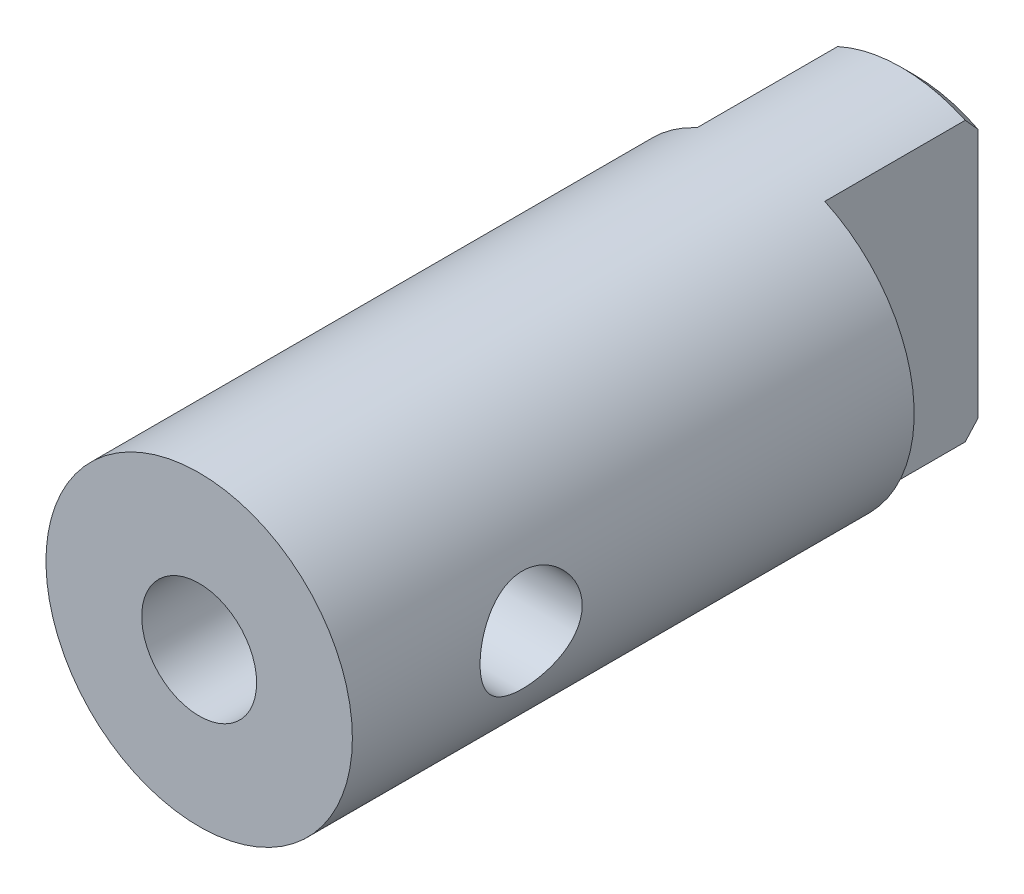
ISO-10303-21;
HEADER;
FILE_DESCRIPTION(('STEP AP214'),'2;1');
FILE_NAME('part.step','',(''),(''),'','','');
FILE_SCHEMA(('AUTOMOTIVE_DESIGN { 1 0 10303 214 1 1 1 1 }'));
ENDSEC;
DATA;
#1=APPLICATION_CONTEXT('core data for automotive mechanical design processes');
#2=APPLICATION_PROTOCOL_DEFINITION('international standard','automotive_design',2000,#1);
#3=PRODUCT_CONTEXT('',#1,'mechanical');
#4=PRODUCT('Part','Part','',(#3));
#5=PRODUCT_RELATED_PRODUCT_CATEGORY('part','',(#4));
#6=PRODUCT_DEFINITION_FORMATION('','',#4);
#7=PRODUCT_DEFINITION_CONTEXT('part definition',#1,'design');
#8=PRODUCT_DEFINITION('design','',#6,#7);
#9=PRODUCT_DEFINITION_SHAPE('','',#8);
#10=(LENGTH_UNIT() NAMED_UNIT(*) SI_UNIT(.MILLI.,.METRE.));
#11=(NAMED_UNIT(*) PLANE_ANGLE_UNIT() SI_UNIT($,.RADIAN.));
#12=(NAMED_UNIT(*) SI_UNIT($,.STERADIAN.) SOLID_ANGLE_UNIT());
#13=UNCERTAINTY_MEASURE_WITH_UNIT(LENGTH_MEASURE(1.E-05),#10,'distance_accuracy_value','');
#14=(GEOMETRIC_REPRESENTATION_CONTEXT(3) GLOBAL_UNCERTAINTY_ASSIGNED_CONTEXT((#13)) GLOBAL_UNIT_ASSIGNED_CONTEXT((#10,
#11,#12)) REPRESENTATION_CONTEXT('',''));
#15=CARTESIAN_POINT('',(0.,0.,0.));
#16=DIRECTION('',(0.,0.,1.));
#17=DIRECTION('',(1.,0.,0.));
#18=AXIS2_PLACEMENT_3D('',#15,#16,#17);
#19=CARTESIAN_POINT('',(0.,0.,28.));
#20=DIRECTION('',(0.,0.,1.));
#21=DIRECTION('',(1.,0.,0.));
#22=AXIS2_PLACEMENT_3D('',#19,#20,#21);
#23=PLANE('',#22);
#24=CARTESIAN_POINT('',(0.,0.,28.));
#25=DIRECTION('',(0.,0.,1.));
#26=DIRECTION('',(1.,0.,0.));
#27=AXIS2_PLACEMENT_3D('',#24,#25,#26);
#28=CIRCLE('',#27,6.);
#29=CARTESIAN_POINT('',(6.,0.,28.));
#30=VERTEX_POINT('',#29);
#31=EDGE_CURVE('E203',#30,#30,#28,.T.);
#32=ORIENTED_EDGE('',*,*,#31,.T.);
#33=EDGE_LOOP('',(#32));
#34=FACE_BOUND('',#33,.T.);
#35=CARTESIAN_POINT('',(0.,0.,28.));
#36=DIRECTION('',(0.,0.,1.));
#37=DIRECTION('',(1.,0.,0.));
#38=AXIS2_PLACEMENT_3D('',#35,#36,#37);
#39=CIRCLE('',#38,2.25);
#40=CARTESIAN_POINT('',(2.25,0.,28.));
#41=VERTEX_POINT('',#40);
#42=EDGE_CURVE('E183',#41,#41,#39,.T.);
#43=ORIENTED_EDGE('',*,*,#42,.F.);
#44=EDGE_LOOP('',(#43));
#45=FACE_BOUND('',#44,.T.);
#46=ADVANCED_FACE('F31',(#34,#45),#23,.T.);
#47=CARTESIAN_POINT('',(0.,0.,28.));
#48=DIRECTION('',(0.,0.,-1.));
#49=DIRECTION('',(-1.,0.,0.));
#50=AXIS2_PLACEMENT_3D('',#47,#48,#49);
#51=CYLINDRICAL_SURFACE('',#50,6.);
#52=CARTESIAN_POINT('',(6.,0.,19.));
#53=CARTESIAN_POINT('',(6.00000030601888,-0.109126725773446,18.9999994925367));
#54=CARTESIAN_POINT('',(5.9969953901509,-0.2182503890771,19.0089605322544));
#55=CARTESIAN_POINT('',(5.98530420406562,-0.433283521745944,19.0444582176344));
#56=CARTESIAN_POINT('',(5.97661734404305,-0.539192656237635,19.0709966878978));
#57=CARTESIAN_POINT('',(5.95450615812885,-0.744665579003552,19.1406384867681));
#58=CARTESIAN_POINT('',(5.94108975461707,-0.844239651772068,19.1837141249185));
#59=CARTESIAN_POINT('',(5.91088891434684,-1.03474987361065,19.2850823456767));
#60=CARTESIAN_POINT('',(5.89410381335556,-1.12568431391741,19.3433779300052));
#61=CARTESIAN_POINT('',(5.8582818888601,-1.29948335004453,19.4756516097175));
#62=CARTESIAN_POINT('',(5.8391911292757,-1.38200740059662,19.550062468521));
#63=CARTESIAN_POINT('',(5.80120629566243,-1.53366538540417,19.7115343094131));
#64=CARTESIAN_POINT('',(5.78231226581098,-1.60279637097892,19.798598069857));
#65=CARTESIAN_POINT('',(5.74626664954548,-1.72764988445572,19.9859702303929));
#66=CARTESIAN_POINT('',(5.72918078551376,-1.78292971644206,20.0865874794642));
#67=CARTESIAN_POINT('',(5.69950610837202,-1.87563774775544,20.2963521889171));
#68=CARTESIAN_POINT('',(5.68691592321491,-1.91307139477353,20.4054970343255));
#69=CARTESIAN_POINT('',(5.66822606538755,-1.96774692301833,20.6253464429934));
#70=CARTESIAN_POINT('',(5.66192191539223,-1.98562689654354,20.7358744169781));
#71=CARTESIAN_POINT('',(5.65591313259015,-2.00268224666895,20.9585275083118));
#72=CARTESIAN_POINT('',(5.6562064604546,-2.00186340320944,21.0706521214184));
#73=CARTESIAN_POINT('',(5.6631803001636,-1.98203980740684,21.287873260888));
#74=CARTESIAN_POINT('',(5.66956831735066,-1.96386782633399,21.393056805838));
#75=CARTESIAN_POINT('',(5.68753315449102,-1.91121232569883,21.5987868392137));
#76=CARTESIAN_POINT('',(5.69911059568215,-1.87672685318374,21.6993327708701));
#77=CARTESIAN_POINT('',(5.72635822262498,-1.79187811612042,21.894825499183));
#78=CARTESIAN_POINT('',(5.74209131586235,-1.74126809741452,21.9896560509391));
#79=CARTESIAN_POINT('',(5.77585117151453,-1.62577821260628,22.1697418165595));
#80=CARTESIAN_POINT('',(5.79387859580927,-1.56089422472801,22.2549942538668));
#81=CARTESIAN_POINT('',(5.83134658335482,-1.41469866536447,22.4181831963215));
#82=CARTESIAN_POINT('',(5.85081178709686,-1.33270630015262,22.4955053890181));
#83=CARTESIAN_POINT('',(5.88813876774073,-1.15667913994013,22.6354625333268));
#84=CARTESIAN_POINT('',(5.90600039076135,-1.06264319132163,22.698096076329));
#85=CARTESIAN_POINT('',(5.93834215875587,-0.863895226092535,22.8073926004701));
#86=CARTESIAN_POINT('',(5.95278700016078,-0.759086552832673,22.8538909826815));
#87=CARTESIAN_POINT('',(5.9764113428887,-0.542538166729016,22.9284063479114));
#88=CARTESIAN_POINT('',(5.98559267309759,-0.430800876309908,22.9564297508469));
#89=CARTESIAN_POINT('',(5.99735254142881,-0.208767659058609,22.9921113320447));
#90=CARTESIAN_POINT('',(6.00020003667456,-0.098619199729693,23.0005996183455));
#91=CARTESIAN_POINT('',(5.99977805389655,0.121550139920474,22.9993346528031));
#92=CARTESIAN_POINT('',(5.99650960838725,0.231571038639301,22.9895844800402));
#93=CARTESIAN_POINT('',(5.98440049434209,0.445039732608511,22.9527761845281));
#94=CARTESIAN_POINT('',(5.97572397422385,0.548585613669687,22.926227587901));
#95=CARTESIAN_POINT('',(5.9538369366014,0.749711917159147,22.8572131110665));
#96=CARTESIAN_POINT('',(5.9406258409335,0.847291577017213,22.8147452010644));
#97=CARTESIAN_POINT('',(5.9105786257458,1.03657659278655,22.7138591363184));
#98=CARTESIAN_POINT('',(5.89365629511572,1.12805991843429,22.6550508134337));
#99=CARTESIAN_POINT('',(5.85810507832525,1.30012966027117,22.523611699973));
#100=CARTESIAN_POINT('',(5.83947567187655,1.38071273559115,22.4509766879365));
#101=CARTESIAN_POINT('',(5.8015369596089,1.5325050156126,22.2900424979868));
#102=CARTESIAN_POINT('',(5.78223522174856,1.60312193849154,22.2011815461463));
#103=CARTESIAN_POINT('',(5.74599946589418,1.72851504464715,22.0124568643782));
#104=CARTESIAN_POINT('',(5.72906546764005,1.78329109586203,21.9125930427318));
#105=CARTESIAN_POINT('',(5.69964783582767,1.87519386083272,21.7046539694202));
#106=CARTESIAN_POINT('',(5.68715521585958,1.91235626433004,21.5965958416625));
#107=CARTESIAN_POINT('',(5.66821664612899,1.96778933351871,21.3752426999117));
#108=CARTESIAN_POINT('',(5.66176797247279,1.98606850990788,21.2619500691913));
#109=CARTESIAN_POINT('',(5.65595717748355,2.00255256495468,21.0396058079182));
#110=CARTESIAN_POINT('',(5.6562480051483,2.0017405146168,20.9306353194264));
#111=CARTESIAN_POINT('',(5.66302539647735,1.98248458689739,20.7144698501559));
#112=CARTESIAN_POINT('',(5.66951159138723,1.96404175891717,20.6072747640898));
#113=CARTESIAN_POINT('',(5.68769048609783,1.91074362625869,20.3997286739951));
#114=CARTESIAN_POINT('',(5.69928196044955,1.87620669203103,20.299286349991));
#115=CARTESIAN_POINT('',(5.72632797636937,1.79195873151949,20.1055451861235));
#116=CARTESIAN_POINT('',(5.74178337526786,1.74224433710761,20.012247937624));
#117=CARTESIAN_POINT('',(5.77565658452092,1.62652138516686,19.8310326601542));
#118=CARTESIAN_POINT('',(5.79417423284274,1.55989648552916,19.7435269962032));
#119=CARTESIAN_POINT('',(5.83166712566506,1.4132857662713,19.5806203732316));
#120=CARTESIAN_POINT('',(5.85064249824745,1.33329616890296,19.5052228486239));
#121=CARTESIAN_POINT('',(5.88780061051088,1.15848311384138,19.3657111754216));
#122=CARTESIAN_POINT('',(5.90592363602513,1.06320302699946,19.302151304498));
#123=CARTESIAN_POINT('',(5.93851982345224,0.86271471481325,19.1920191422987));
#124=CARTESIAN_POINT('',(5.9529939181586,0.757509036264697,19.1454425081559));
#125=CARTESIAN_POINT('',(5.97611030137084,0.544987294401951,19.0725567350227));
#126=CARTESIAN_POINT('',(5.98498424845045,0.437975515352818,19.0454350674732));
#127=CARTESIAN_POINT('',(5.99692814128444,0.220640832020495,19.0091594386457));
#128=CARTESIAN_POINT('',(5.9999996906381,0.110318851137493,19.0000005130069));
#129=CARTESIAN_POINT('',(6.,0.,19.));
#130=B_SPLINE_CURVE_WITH_KNOTS('',3,(#52,#53,#54,#55,#56,#57,#58,#59,#60,#61,#62,#63,#64,#65,
#66,#67,#68,#69,#70,#71,#72,#73,#74,#75,#76,#77,#78,#79,#80,#81,#82,#83,#84,#85,#86,#87,#88,#89,
#90,#91,#92,#93,#94,#95,#96,#97,#98,#99,#100,#101,#102,#103,#104,#105,#106,#107,#108,#109,#110,
#111,#112,#113,#114,#115,#116,#117,#118,#119,#120,#121,#122,#123,#124,#125,#126,#127,#128,#129),
.UNSPECIFIED.,.T.,.F.,(4,2,2,2,2,2,2,2,2,2,2,2,2,2,2,2,2,2,2,2,2,2,2,2,2,2,2,2,2,2,2,2,2,2,2,2,
2,2,4),(0.,0.326974212052022,0.653982370535041,0.980445345740547,1.3069727555982,
1.64369368565512,1.9804886657506,2.32696769646941,2.67334089385667,3.0080385148368,
3.34263267974971,3.6619365310256,3.98127861710964,4.30576342310261,4.63034205116414,
4.97186611622734,5.31342291933236,5.65836811300715,6.00319337754416,6.33307166350339,
6.66289426328353,6.98316315956427,7.30347290568207,7.63220799687473,7.96104361643782,
8.30482045761503,8.64860016469993,8.9916802765354,9.3346056941168,9.65991332128516,
9.9852015870275,10.3043117416083,10.6234927635195,10.9566013338361,11.2898042224756,
11.635993216702,11.9820936230491,12.3127311674763,12.6432773207628),.UNSPECIFIED.);
#131=CARTESIAN_POINT('',(6.,0.,19.));
#132=VERTEX_POINT('',#131);
#133=EDGE_CURVE('E174',#132,#132,#130,.T.);
#134=ORIENTED_EDGE('',*,*,#133,.T.);
#135=EDGE_LOOP('',(#134));
#136=FACE_BOUND('',#135,.T.);
#137=CARTESIAN_POINT('',(-6.,0.,23.));
#138=CARTESIAN_POINT('',(-6.00000030601888,-0.109126725773447,23.0000005074633));
#139=CARTESIAN_POINT('',(-5.9969953901509,-0.218250389077101,22.9910394677456));
#140=CARTESIAN_POINT('',(-5.98530420406562,-0.433283521745945,22.9555417823656));
#141=CARTESIAN_POINT('',(-5.97661734404305,-0.539192656237635,22.9290033121022));
#142=CARTESIAN_POINT('',(-5.95450615812885,-0.744665579003552,22.8593615132319));
#143=CARTESIAN_POINT('',(-5.94108975461707,-0.844239651772068,22.8162858750815));
#144=CARTESIAN_POINT('',(-5.91088891434684,-1.03474987361065,22.7149176543233));
#145=CARTESIAN_POINT('',(-5.89410381335556,-1.12568431391741,22.6566220699948));
#146=CARTESIAN_POINT('',(-5.8582818888601,-1.29948335004453,22.5243483902825));
#147=CARTESIAN_POINT('',(-5.8391911292757,-1.38200740059662,22.449937531479));
#148=CARTESIAN_POINT('',(-5.80120629566243,-1.53366538540417,22.2884656905869));
#149=CARTESIAN_POINT('',(-5.78231226581098,-1.60279637097892,22.201401930143));
#150=CARTESIAN_POINT('',(-5.74626664954548,-1.72764988445572,22.0140297696071));
#151=CARTESIAN_POINT('',(-5.72918078551377,-1.78292971644206,21.9134125205358));
#152=CARTESIAN_POINT('',(-5.69950610837202,-1.87563774775544,21.7036478110829));
#153=CARTESIAN_POINT('',(-5.68691592321491,-1.91307139477353,21.5945029656745));
#154=CARTESIAN_POINT('',(-5.66822606538755,-1.96774692301833,21.3746535570066));
#155=CARTESIAN_POINT('',(-5.66192191539223,-1.98562689654354,21.2641255830219));
#156=CARTESIAN_POINT('',(-5.65591313259015,-2.00268224666895,21.0414724916882));
#157=CARTESIAN_POINT('',(-5.6562064604546,-2.00186340320944,20.9293478785816));
#158=CARTESIAN_POINT('',(-5.6631803001636,-1.98203980740684,20.712126739112));
#159=CARTESIAN_POINT('',(-5.66956831735066,-1.96386782633399,20.606943194162));
#160=CARTESIAN_POINT('',(-5.68753315449102,-1.91121232569883,20.4012131607863));
#161=CARTESIAN_POINT('',(-5.69911059568215,-1.87672685318374,20.3006672291299));
#162=CARTESIAN_POINT('',(-5.72635822262498,-1.79187811612042,20.105174500817));
#163=CARTESIAN_POINT('',(-5.74209131586235,-1.74126809741452,20.0103439490609));
#164=CARTESIAN_POINT('',(-5.77585117151453,-1.62577821260628,19.8302581834406));
#165=CARTESIAN_POINT('',(-5.79387859580927,-1.56089422472801,19.7450057461332));
#166=CARTESIAN_POINT('',(-5.83134658335482,-1.41469866536447,19.5818168036785));
#167=CARTESIAN_POINT('',(-5.85081178709686,-1.33270630015262,19.5044946109819));
#168=CARTESIAN_POINT('',(-5.88813876774073,-1.15667913994013,19.3645374666732));
#169=CARTESIAN_POINT('',(-5.90600039076135,-1.06264319132163,19.301903923671));
#170=CARTESIAN_POINT('',(-5.93834215875587,-0.863895226092536,19.1926073995299));
#171=CARTESIAN_POINT('',(-5.95278700016078,-0.759086552832674,19.1461090173185));
#172=CARTESIAN_POINT('',(-5.9764113428887,-0.542538166729017,19.0715936520886));
#173=CARTESIAN_POINT('',(-5.98559267309759,-0.430800876309908,19.0435702491531));
#174=CARTESIAN_POINT('',(-5.99735254142881,-0.208767659058609,19.0078886679553));
#175=CARTESIAN_POINT('',(-6.00020003667456,-0.0986191997296935,18.9994003816545));
#176=CARTESIAN_POINT('',(-5.99977805389655,0.121550139920474,19.0006653471969));
#177=CARTESIAN_POINT('',(-5.99650960838725,0.2315710386393,19.0104155199598));
#178=CARTESIAN_POINT('',(-5.98440049434209,0.44503973260851,19.0472238154719));
#179=CARTESIAN_POINT('',(-5.97572397422385,0.548585613669686,19.073772412099));
#180=CARTESIAN_POINT('',(-5.9538369366014,0.749711917159147,19.1427868889335));
#181=CARTESIAN_POINT('',(-5.9406258409335,0.847291577017212,19.1852547989356));
#182=CARTESIAN_POINT('',(-5.9105786257458,1.03657659278654,19.2861408636816));
#183=CARTESIAN_POINT('',(-5.89365629511572,1.12805991843429,19.3449491865663));
#184=CARTESIAN_POINT('',(-5.85810507832525,1.30012966027117,19.476388300027));
#185=CARTESIAN_POINT('',(-5.83947567187655,1.38071273559115,19.5490233120635));
#186=CARTESIAN_POINT('',(-5.8015369596089,1.5325050156126,19.7099575020132));
#187=CARTESIAN_POINT('',(-5.78223522174856,1.60312193849154,19.7988184538537));
#188=CARTESIAN_POINT('',(-5.74599946589417,1.72851504464715,19.9875431356218));
#189=CARTESIAN_POINT('',(-5.72906546764005,1.78329109586202,20.0874069572682));
#190=CARTESIAN_POINT('',(-5.69964783582767,1.87519386083272,20.2953460305798));
#191=CARTESIAN_POINT('',(-5.68715521585958,1.91235626433004,20.4034041583375));
#192=CARTESIAN_POINT('',(-5.66821664612899,1.96778933351871,20.6247573000883));
#193=CARTESIAN_POINT('',(-5.66176797247279,1.98606850990788,20.7380499308087));
#194=CARTESIAN_POINT('',(-5.65595717748355,2.00255256495468,20.9603941920818));
#195=CARTESIAN_POINT('',(-5.6562480051483,2.0017405146168,21.0693646805736));
#196=CARTESIAN_POINT('',(-5.66302539647735,1.98248458689739,21.2855301498441));
#197=CARTESIAN_POINT('',(-5.66951159138723,1.96404175891717,21.3927252359102));
#198=CARTESIAN_POINT('',(-5.68769048609783,1.91074362625869,21.6002713260049));
#199=CARTESIAN_POINT('',(-5.69928196044955,1.87620669203103,21.700713650009));
#200=CARTESIAN_POINT('',(-5.72632797636937,1.79195873151949,21.8944548138765));
#201=CARTESIAN_POINT('',(-5.74178337526786,1.74224433710761,21.987752062376));
#202=CARTESIAN_POINT('',(-5.77565658452093,1.62652138516686,22.1689673398458));
#203=CARTESIAN_POINT('',(-5.79417423284274,1.55989648552916,22.2564730037968));
#204=CARTESIAN_POINT('',(-5.83166712566506,1.4132857662713,22.4193796267684));
#205=CARTESIAN_POINT('',(-5.85064249824745,1.33329616890297,22.4947771513761));
#206=CARTESIAN_POINT('',(-5.88780061051088,1.15848311384138,22.6342888245784));
#207=CARTESIAN_POINT('',(-5.90592363602513,1.06320302699946,22.697848695502));
#208=CARTESIAN_POINT('',(-5.93851982345224,0.862714714813249,22.8079808577013));
#209=CARTESIAN_POINT('',(-5.9529939181586,0.757509036264697,22.8545574918441));
#210=CARTESIAN_POINT('',(-5.97611030137084,0.544987294401951,22.9274432649773));
#211=CARTESIAN_POINT('',(-5.98498424845045,0.437975515352817,22.9545649325268));
#212=CARTESIAN_POINT('',(-5.99692814128444,0.220640832020494,22.9908405613543));
#213=CARTESIAN_POINT('',(-5.9999996906381,0.110318851137493,22.9999994869931));
#214=CARTESIAN_POINT('',(-6.,0.,23.));
#215=B_SPLINE_CURVE_WITH_KNOTS('',3,(#137,#138,#139,#140,#141,#142,#143,#144,#145,#146,#147,
#148,#149,#150,#151,#152,#153,#154,#155,#156,#157,#158,#159,#160,#161,#162,#163,#164,#165,#166,
#167,#168,#169,#170,#171,#172,#173,#174,#175,#176,#177,#178,#179,#180,#181,#182,#183,#184,#185,
#186,#187,#188,#189,#190,#191,#192,#193,#194,#195,#196,#197,#198,#199,#200,#201,#202,#203,#204,
#205,#206,#207,#208,#209,#210,#211,#212,#213,#214),.UNSPECIFIED.,.T.,.F.,(4,2,2,2,2,2,2,2,2,2,2,
2,2,2,2,2,2,2,2,2,2,2,2,2,2,2,2,2,2,2,2,2,2,2,2,2,2,2,4),(0.,0.326974212052022,
0.653982370535041,0.980445345740548,1.3069727555982,1.64369368565512,1.9804886657506,
2.32696769646941,2.67334089385667,3.0080385148368,3.34263267974971,3.6619365310256,
3.98127861710964,4.30576342310261,4.63034205116414,4.97186611622734,5.31342291933236,
5.65836811300715,6.00319337754416,6.33307166350339,6.66289426328353,6.98316315956427,
7.30347290568207,7.63220799687473,7.96104361643782,8.30482045761503,8.64860016469993,
8.99168027653541,9.3346056941168,9.65991332128516,9.9852015870275,10.3043117416083,
10.6234927635195,10.9566013338361,11.2898042224756,11.635993216702,11.9820936230491,
12.3127311674763,12.6432773207628),.UNSPECIFIED.);
#216=CARTESIAN_POINT('',(-6.,0.,23.));
#217=VERTEX_POINT('',#216);
#218=EDGE_CURVE('E178',#217,#217,#215,.T.);
#219=ORIENTED_EDGE('',*,*,#218,.T.);
#220=EDGE_LOOP('',(#219));
#221=FACE_BOUND('',#220,.T.);
#222=ORIENTED_EDGE('',*,*,#31,.F.);
#223=EDGE_LOOP('',(#222));
#224=FACE_BOUND('',#223,.T.);
#225=DIRECTION('',(0.,0.,-1.));
#226=VECTOR('',#225,1.);
#227=CARTESIAN_POINT('',(-2.5,-5.45435605731786,28.));
#228=LINE('',#227,#226);
#229=CARTESIAN_POINT('',(-2.5,-5.45435605731786,0.500000000000007));
#230=VERTEX_POINT('',#229);
#231=CARTESIAN_POINT('',(-2.5,-5.45435605731786,6.));
#232=VERTEX_POINT('',#231);
#233=EDGE_CURVE('E191',#230,#232,#228,.F.);
#234=ORIENTED_EDGE('',*,*,#233,.F.);
#235=CARTESIAN_POINT('',(0.,0.,0.500000000000007));
#236=DIRECTION('',(0.,0.,1.));
#237=DIRECTION('',(1.,0.,0.));
#238=AXIS2_PLACEMENT_3D('',#235,#236,#237);
#239=CIRCLE('',#238,6.);
#240=CARTESIAN_POINT('',(2.5,-5.45435605731786,0.500000000000007));
#241=VERTEX_POINT('',#240);
#242=EDGE_CURVE('E217',#230,#241,#239,.T.);
#243=ORIENTED_EDGE('',*,*,#242,.T.);
#244=DIRECTION('',(0.,0.,-1.));
#245=VECTOR('',#244,1.);
#246=CARTESIAN_POINT('',(2.5,-5.45435605731786,28.));
#247=LINE('',#246,#245);
#248=CARTESIAN_POINT('',(2.5,-5.45435605731786,6.));
#249=VERTEX_POINT('',#248);
#250=EDGE_CURVE('E198',#241,#249,#247,.F.);
#251=ORIENTED_EDGE('',*,*,#250,.T.);
#252=CARTESIAN_POINT('',(0.,0.,6.));
#253=DIRECTION('',(0.,0.,-1.));
#254=DIRECTION('',(-1.,0.,0.));
#255=AXIS2_PLACEMENT_3D('',#252,#253,#254);
#256=CIRCLE('',#255,6.);
#257=CARTESIAN_POINT('',(2.5,5.45435605731786,6.));
#258=VERTEX_POINT('',#257);
#259=EDGE_CURVE('E207',#258,#249,#256,.T.);
#260=ORIENTED_EDGE('',*,*,#259,.F.);
#261=DIRECTION('',(0.,0.,-1.));
#262=VECTOR('',#261,1.);
#263=CARTESIAN_POINT('',(2.5,5.45435605731786,28.));
#264=LINE('',#263,#262);
#265=CARTESIAN_POINT('',(2.5,5.45435605731786,0.500000000000007));
#266=VERTEX_POINT('',#265);
#267=EDGE_CURVE('E200',#258,#266,#264,.T.);
#268=ORIENTED_EDGE('',*,*,#267,.T.);
#269=CARTESIAN_POINT('',(0.,0.,0.500000000000007));
#270=DIRECTION('',(0.,0.,1.));
#271=DIRECTION('',(1.,0.,0.));
#272=AXIS2_PLACEMENT_3D('',#269,#270,#271);
#273=CIRCLE('',#272,6.);
#274=CARTESIAN_POINT('',(-2.5,5.45435605731786,0.500000000000007));
#275=VERTEX_POINT('',#274);
#276=EDGE_CURVE('E215',#266,#275,#273,.T.);
#277=ORIENTED_EDGE('',*,*,#276,.T.);
#278=DIRECTION('',(0.,0.,-1.));
#279=VECTOR('',#278,1.);
#280=CARTESIAN_POINT('',(-2.5,5.45435605731786,28.));
#281=LINE('',#280,#279);
#282=CARTESIAN_POINT('',(-2.5,5.45435605731786,6.));
#283=VERTEX_POINT('',#282);
#284=EDGE_CURVE('E193',#283,#275,#281,.T.);
#285=ORIENTED_EDGE('',*,*,#284,.F.);
#286=CARTESIAN_POINT('',(0.,0.,6.));
#287=DIRECTION('',(0.,0.,1.));
#288=DIRECTION('',(1.,0.,0.));
#289=AXIS2_PLACEMENT_3D('',#286,#287,#288);
#290=CIRCLE('',#289,6.);
#291=EDGE_CURVE('E212',#283,#232,#290,.T.);
#292=ORIENTED_EDGE('',*,*,#291,.T.);
#293=EDGE_LOOP('',(#234,#243,#251,#260,#268,#277,#285,#292));
#294=FACE_BOUND('',#293,.T.);
#295=ADVANCED_FACE('F33',(#136,#221,#224,#294),#51,.T.);
#296=CARTESIAN_POINT('',(0.,0.,0.));
#297=DIRECTION('',(0.,0.,1.));
#298=DIRECTION('',(1.,0.,0.));
#299=AXIS2_PLACEMENT_3D('',#296,#297,#298);
#300=PLANE('',#299);
#301=DIRECTION('',(0.,-1.,0.));
#302=VECTOR('',#301,1.);
#303=CARTESIAN_POINT('',(2.5,0.,0.));
#304=LINE('',#303,#302);
#305=CARTESIAN_POINT('',(2.5,4.89897948556635,0.));
#306=VERTEX_POINT('',#305);
#307=CARTESIAN_POINT('',(2.5,-4.89897948556635,0.));
#308=VERTEX_POINT('',#307);
#309=EDGE_CURVE('E205',#306,#308,#304,.T.);
#310=ORIENTED_EDGE('',*,*,#309,.T.);
#311=CARTESIAN_POINT('',(0.,0.,0.));
#312=DIRECTION('',(0.,0.,1.));
#313=DIRECTION('',(1.,0.,0.));
#314=AXIS2_PLACEMENT_3D('',#311,#312,#313);
#315=CIRCLE('',#314,5.5);
#316=CARTESIAN_POINT('',(-2.5,-4.89897948556635,0.));
#317=VERTEX_POINT('',#316);
#318=EDGE_CURVE('E53',#308,#317,#315,.F.);
#319=ORIENTED_EDGE('',*,*,#318,.T.);
#320=DIRECTION('',(0.,-1.,0.));
#321=VECTOR('',#320,1.);
#322=CARTESIAN_POINT('',(-2.5,0.,0.));
#323=LINE('',#322,#321);
#324=CARTESIAN_POINT('',(-2.5,4.89897948556635,0.));
#325=VERTEX_POINT('',#324);
#326=EDGE_CURVE('E210',#325,#317,#323,.T.);
#327=ORIENTED_EDGE('',*,*,#326,.F.);
#328=CARTESIAN_POINT('',(0.,0.,0.));
#329=DIRECTION('',(0.,0.,1.));
#330=DIRECTION('',(1.,0.,0.));
#331=AXIS2_PLACEMENT_3D('',#328,#329,#330);
#332=CIRCLE('',#331,5.5);
#333=EDGE_CURVE('E144',#325,#306,#332,.F.);
#334=ORIENTED_EDGE('',*,*,#333,.T.);
#335=EDGE_LOOP('',(#310,#319,#327,#334));
#336=FACE_BOUND('',#335,.T.);
#337=ADVANCED_FACE('F112',(#336),#300,.F.);
#338=CARTESIAN_POINT('',(8.5,-10.,6.));
#339=DIRECTION('',(0.,0.,-1.));
#340=DIRECTION('',(-1.,0.,0.));
#341=AXIS2_PLACEMENT_3D('',#338,#339,#340);
#342=PLANE('',#341);
#343=ORIENTED_EDGE('',*,*,#259,.T.);
#344=DIRECTION('',(0.,1.,0.));
#345=VECTOR('',#344,1.);
#346=CARTESIAN_POINT('',(2.5,-10.,6.));
#347=LINE('',#346,#345);
#348=EDGE_CURVE('E195',#249,#258,#347,.T.);
#349=ORIENTED_EDGE('',*,*,#348,.T.);
#350=EDGE_LOOP('',(#343,#349));
#351=FACE_BOUND('',#350,.T.);
#352=ADVANCED_FACE('F119',(#351),#342,.T.);
#353=CARTESIAN_POINT('',(2.5,-10.,-1.));
#354=DIRECTION('',(-1.,0.,0.));
#355=DIRECTION('',(0.,0.,1.));
#356=AXIS2_PLACEMENT_3D('',#353,#354,#355);
#357=PLANE('',#356);
#358=ORIENTED_EDGE('',*,*,#250,.F.);
#359=CARTESIAN_POINT('',(2.5,-5.45435605731786,0.500000000000007));
#360=CARTESIAN_POINT('',(2.5,-5.36221449906135,0.416198865027463));
#361=CARTESIAN_POINT('',(2.5,-5.26986235186539,0.332631642381078));
#362=CARTESIAN_POINT('',(2.5,-5.08473682818215,0.165964975454563));
#363=CARTESIAN_POINT('',(2.5,-4.99196345146095,0.0828655314342798));
#364=CARTESIAN_POINT('',(2.5,-4.89897948556635,0.));
#365=B_SPLINE_CURVE_WITH_KNOTS('',3,(#359,#360,#361,#362,#363,#364),.UNSPECIFIED.,.F.,.F.,(4,2,
4),(0.,0.373646354368434,0.747292916272343),.UNSPECIFIED.);
#366=EDGE_CURVE('E138',#241,#308,#365,.T.);
#367=ORIENTED_EDGE('',*,*,#366,.T.);
#368=ORIENTED_EDGE('',*,*,#309,.F.);
#369=CARTESIAN_POINT('',(2.5,4.89897948556635,0.));
#370=CARTESIAN_POINT('',(2.5,4.99196345146095,0.0828655314342794));
#371=CARTESIAN_POINT('',(2.5,5.08473682818215,0.165964975454563));
#372=CARTESIAN_POINT('',(2.5,5.26986235186539,0.332631642381078));
#373=CARTESIAN_POINT('',(2.5,5.36221449906135,0.416198865027463));
#374=CARTESIAN_POINT('',(2.5,5.45435605731786,0.500000000000008));
#375=B_SPLINE_CURVE_WITH_KNOTS('',3,(#369,#370,#371,#372,#373,#374),.UNSPECIFIED.,.F.,.F.,(4,2,
4),(0.,0.373646561903909,0.747292916272344),.UNSPECIFIED.);
#376=EDGE_CURVE('E132',#306,#266,#375,.T.);
#377=ORIENTED_EDGE('',*,*,#376,.T.);
#378=ORIENTED_EDGE('',*,*,#267,.F.);
#379=ORIENTED_EDGE('',*,*,#348,.F.);
#380=EDGE_LOOP('',(#358,#367,#368,#377,#378,#379));
#381=FACE_BOUND('',#380,.T.);
#382=ADVANCED_FACE('F122',(#381),#357,.F.);
#383=CARTESIAN_POINT('',(-8.5,-10.,6.));
#384=DIRECTION('',(0.,0.,1.));
#385=DIRECTION('',(1.,0.,0.));
#386=AXIS2_PLACEMENT_3D('',#383,#384,#385);
#387=PLANE('',#386);
#388=DIRECTION('',(0.,1.,0.));
#389=VECTOR('',#388,1.);
#390=CARTESIAN_POINT('',(-2.5,-10.,6.));
#391=LINE('',#390,#389);
#392=EDGE_CURVE('E188',#232,#283,#391,.T.);
#393=ORIENTED_EDGE('',*,*,#392,.F.);
#394=ORIENTED_EDGE('',*,*,#291,.F.);
#395=EDGE_LOOP('',(#393,#394));
#396=FACE_BOUND('',#395,.T.);
#397=ADVANCED_FACE('F127',(#396),#387,.F.);
#398=CARTESIAN_POINT('',(-2.5,-10.,-3.));
#399=DIRECTION('',(-1.,0.,0.));
#400=DIRECTION('',(0.,0.,1.));
#401=AXIS2_PLACEMENT_3D('',#398,#399,#400);
#402=PLANE('',#401);
#403=ORIENTED_EDGE('',*,*,#326,.T.);
#404=CARTESIAN_POINT('',(-2.5,-4.89897948556635,0.));
#405=CARTESIAN_POINT('',(-2.5,-4.99196345146095,0.0828655314342793));
#406=CARTESIAN_POINT('',(-2.5,-5.08473682818215,0.165964975454563));
#407=CARTESIAN_POINT('',(-2.5,-5.26986235186538,0.332631642381077));
#408=CARTESIAN_POINT('',(-2.5,-5.36221449906135,0.416198865027462));
#409=CARTESIAN_POINT('',(-2.5,-5.45435605731786,0.500000000000007));
#410=B_SPLINE_CURVE_WITH_KNOTS('',3,(#404,#405,#406,#407,#408,#409),.UNSPECIFIED.,.F.,.F.,(4,2,
4),(0.,0.373646561903908,0.747292916272343),.UNSPECIFIED.);
#411=EDGE_CURVE('E11',#317,#230,#410,.T.);
#412=ORIENTED_EDGE('',*,*,#411,.T.);
#413=ORIENTED_EDGE('',*,*,#233,.T.);
#414=ORIENTED_EDGE('',*,*,#392,.T.);
#415=ORIENTED_EDGE('',*,*,#284,.T.);
#416=CARTESIAN_POINT('',(-2.5,5.45435605731786,0.500000000000007));
#417=CARTESIAN_POINT('',(-2.5,5.36221449906135,0.416198865027463));
#418=CARTESIAN_POINT('',(-2.5,5.26986235186538,0.332631642381077));
#419=CARTESIAN_POINT('',(-2.5,5.08473682818215,0.165964975454563));
#420=CARTESIAN_POINT('',(-2.5,4.99196345146095,0.0828655314342792));
#421=CARTESIAN_POINT('',(-2.5,4.89897948556635,0.));
#422=B_SPLINE_CURVE_WITH_KNOTS('',3,(#416,#417,#418,#419,#420,#421),.UNSPECIFIED.,.F.,.F.,(4,2,
4),(0.,0.373646354368434,0.747292916272342),.UNSPECIFIED.);
#423=EDGE_CURVE('E45',#275,#325,#422,.T.);
#424=ORIENTED_EDGE('',*,*,#423,.T.);
#425=EDGE_LOOP('',(#403,#412,#413,#414,#415,#424));
#426=FACE_BOUND('',#425,.T.);
#427=ADVANCED_FACE('F148',(#426),#402,.T.);
#428=CARTESIAN_POINT('',(0.,0.,0.500000000000007));
#429=DIRECTION('',(0.,0.,1.));
#430=DIRECTION('',(1.,0.,0.));
#431=AXIS2_PLACEMENT_3D('',#428,#429,#430);
#432=CONICAL_SURFACE('',#431,6.,0.785398163397445);
#433=ORIENTED_EDGE('',*,*,#411,.F.);
#434=ORIENTED_EDGE('',*,*,#318,.F.);
#435=ORIENTED_EDGE('',*,*,#366,.F.);
#436=ORIENTED_EDGE('',*,*,#242,.F.);
#437=EDGE_LOOP('',(#433,#434,#435,#436));
#438=FACE_BOUND('',#437,.T.);
#439=ADVANCED_FACE('F103',(#438),#432,.T.);
#440=CARTESIAN_POINT('',(0.,0.,0.500000000000007));
#441=DIRECTION('',(0.,0.,1.));
#442=DIRECTION('',(1.,0.,0.));
#443=AXIS2_PLACEMENT_3D('',#440,#441,#442);
#444=CONICAL_SURFACE('',#443,6.,0.785398163397445);
#445=ORIENTED_EDGE('',*,*,#376,.F.);
#446=ORIENTED_EDGE('',*,*,#333,.F.);
#447=ORIENTED_EDGE('',*,*,#423,.F.);
#448=ORIENTED_EDGE('',*,*,#276,.F.);
#449=EDGE_LOOP('',(#445,#446,#447,#448));
#450=FACE_BOUND('',#449,.T.);
#451=ADVANCED_FACE('F94',(#450),#444,.T.);
#452=CARTESIAN_POINT('',(0.,0.,8.14806360718799));
#453=DIRECTION('',(0.,0.,1.));
#454=DIRECTION('',(1.,0.,0.));
#455=AXIS2_PLACEMENT_3D('',#452,#453,#454);
#456=CONICAL_SURFACE('',#455,0.,1.02974425867666);
#457=CARTESIAN_POINT('',(0.,0.,9.5));
#458=DIRECTION('',(0.,0.,1.));
#459=DIRECTION('',(1.,0.,0.));
#460=AXIS2_PLACEMENT_3D('',#457,#458,#459);
#461=CIRCLE('',#460,2.25);
#462=CARTESIAN_POINT('',(2.25,0.,9.5));
#463=VERTEX_POINT('',#462);
#464=EDGE_CURVE('E186',#463,#463,#461,.T.);
#465=ORIENTED_EDGE('',*,*,#464,.T.);
#466=EDGE_LOOP('',(#465));
#467=FACE_BOUND('',#466,.T.);
#468=CARTESIAN_POINT('',(0.,0.,8.14806360718799));
#469=VERTEX_POINT('',#468);
#470=VERTEX_LOOP('',#469);
#471=FACE_BOUND('',#470,.T.);
#472=ADVANCED_FACE('F91',(#467,#471),#456,.F.);
#473=CARTESIAN_POINT('',(0.,0.,28.));
#474=DIRECTION('',(0.,0.,1.));
#475=DIRECTION('',(1.,0.,0.));
#476=AXIS2_PLACEMENT_3D('',#473,#474,#475);
#477=CYLINDRICAL_SURFACE('',#476,2.25);
#478=CARTESIAN_POINT('',(2.25,0.,19.));
#479=CARTESIAN_POINT('',(2.24999288487792,-0.0929564077510688,19.0000072216849));
#480=CARTESIAN_POINT('',(2.24418066685145,-0.186058867044923,19.0065398410621));
#481=CARTESIAN_POINT('',(2.22142925128134,-0.369214274420424,19.0321886545185));
#482=CARTESIAN_POINT('',(2.20446347068837,-0.459259395190819,19.0513349117754));
#483=CARTESIAN_POINT('',(2.16095052332586,-0.633059704121676,19.1006994776138));
#484=CARTESIAN_POINT('',(2.13446961895885,-0.71685366753544,19.1308412361693));
#485=CARTESIAN_POINT('',(2.07370549509102,-0.877280019713739,19.2005435225661));
#486=CARTESIAN_POINT('',(2.0394219833786,-0.953912140111978,19.2401044031609));
#487=CARTESIAN_POINT('',(1.95018206547283,-1.12793372322791,19.3441926858835));
#488=CARTESIAN_POINT('',(1.89239449632186,-1.22165621203014,19.4124235204993));
#489=CARTESIAN_POINT('',(1.76960730080706,-1.39363403979301,19.5609848014427));
#490=CARTESIAN_POINT('',(1.70458916535033,-1.47184818795925,19.6413464976898));
#491=CARTESIAN_POINT('',(1.57010119716315,-1.6146393451604,19.8143260897913));
#492=CARTESIAN_POINT('',(1.50056382238261,-1.67886658306412,19.9071807442709));
#493=CARTESIAN_POINT('',(1.39832963566286,-1.76327556601988,20.0544623665833));
#494=CARTESIAN_POINT('',(1.36461411528291,-1.78941260753386,20.1048608406722));
#495=CARTESIAN_POINT('',(1.29891345399785,-1.8376552049024,20.2086104498526));
#496=CARTESIAN_POINT('',(1.26692711459505,-1.85976357889674,20.2619594866453));
#497=CARTESIAN_POINT('',(1.2058201439678,-1.89995996310727,20.3725811312032));
#498=CARTESIAN_POINT('',(1.17673344103525,-1.91800292682899,20.4298893012577));
#499=CARTESIAN_POINT('',(1.12416284952649,-1.94927987405275,20.5482869535326));
#500=CARTESIAN_POINT('',(1.10067078767834,-1.96252088775658,20.6093707533953));
#501=CARTESIAN_POINT('',(1.06568420541675,-1.98170478420423,20.7248989337522));
#502=CARTESIAN_POINT('',(1.05285143823248,-1.98849014714572,20.7787814443621));
#503=CARTESIAN_POINT('',(1.03542692942574,-1.99762242349138,20.8881920778377));
#504=CARTESIAN_POINT('',(1.03081725203866,-1.99997899733671,20.9437163500019));
#505=CARTESIAN_POINT('',(1.03073600392101,-2.00002077413812,21.0549240094352));
#506=CARTESIAN_POINT('',(1.03528895023538,-1.99769344405839,21.1106074244288));
#507=CARTESIAN_POINT('',(1.05265713122519,-1.98859319063572,21.2203290141187));
#508=CARTESIAN_POINT('',(1.06549005241878,-1.98181075035167,21.2743634070348));
#509=CARTESIAN_POINT('',(1.10557002815525,-1.95983519929359,21.4069524771078));
#510=CARTESIAN_POINT('',(1.13683578011168,-1.94211061545034,21.4838288182914));
#511=CARTESIAN_POINT('',(1.20720778146151,-1.89917300250212,21.631760921248));
#512=CARTESIAN_POINT('',(1.24634680931229,-1.87392844723353,21.7027905389612));
#513=CARTESIAN_POINT('',(1.3231568298705,-1.82034933674965,21.8309649014165));
#514=CARTESIAN_POINT('',(1.36037800739111,-1.79281996177238,21.8887249263972));
#515=CARTESIAN_POINT('',(1.43608163122487,-1.73277410047581,22.0007687921315));
#516=CARTESIAN_POINT('',(1.47456490759715,-1.7002542781307,22.0550502728741));
#517=CARTESIAN_POINT('',(1.55156809229513,-1.63028908076727,22.1602332172261));
#518=CARTESIAN_POINT('',(1.59008794846108,-1.59284757639579,22.2111372901376));
#519=CARTESIAN_POINT('',(1.66627404151499,-1.51297060780923,22.3095557510127));
#520=CARTESIAN_POINT('',(1.7039401538369,-1.47053442036463,22.3570696464751));
#521=CARTESIAN_POINT('',(1.80038969768936,-1.35275458401289,22.4767645828523));
#522=CARTESIAN_POINT('',(1.85784198745884,-1.27327849008182,22.5460485078604));
#523=CARTESIAN_POINT('',(1.96482800974664,-1.10099912286189,22.6730827361204));
#524=CARTESIAN_POINT('',(2.01437687041642,-1.00822197219426,22.7308551280465));
#525=CARTESIAN_POINT('',(2.09270715251294,-0.830902014850549,22.8213511210463));
#526=CARTESIAN_POINT('',(2.12366463645309,-0.748717201642327,22.8567870956557));
#527=CARTESIAN_POINT('',(2.17641185045676,-0.577684784091003,22.9168925135647));
#528=CARTESIAN_POINT('',(2.19820692214791,-0.488841097528302,22.9415682303395));
#529=CARTESIAN_POINT('',(2.23103468005405,-0.306029366345674,22.9786589544559));
#530=CARTESIAN_POINT('',(2.24199711943686,-0.212031993580773,22.9909939416794));
#531=CARTESIAN_POINT('',(2.25188098364382,-0.0226158409483461,23.0021176776572));
#532=CARTESIAN_POINT('',(2.25080744763877,0.0728023273572432,23.000912095519));
#533=CARTESIAN_POINT('',(2.23748517569486,0.251730898445854,22.9859126055465));
#534=CARTESIAN_POINT('',(2.22641035448673,0.335447608417162,22.9734410161691));
#535=CARTESIAN_POINT('',(2.19553058252894,0.499081211447604,22.938535677303));
#536=CARTESIAN_POINT('',(2.1757239542909,0.578997371104038,22.916100013586));
#537=CARTESIAN_POINT('',(2.1275898517752,0.736868716034058,22.8612681283993));
#538=CARTESIAN_POINT('',(2.09892392565684,0.814580397649823,22.8284748623064));
#539=CARTESIAN_POINT('',(2.03505756028891,0.963113918504801,22.7547922121747));
#540=CARTESIAN_POINT('',(1.99985486460755,1.03393336570417,22.7139000321409));
#541=CARTESIAN_POINT('',(1.90523967675117,1.20253143082004,22.602711476616));
#542=CARTESIAN_POINT('',(1.84263415473347,1.2956478178328,22.528052645464));
#543=CARTESIAN_POINT('',(1.71081449421082,1.46533078133778,22.3662517073999));
#544=CARTESIAN_POINT('',(1.64157687891309,1.54183517973406,22.2790646635558));
#545=CARTESIAN_POINT('',(1.53590283541785,1.64499481990197,22.1390537804465));
#546=CARTESIAN_POINT('',(1.4999550186977,1.67775234093159,22.0902340795285));
#547=CARTESIAN_POINT('',(1.42848782179923,1.7390038000827,21.9896162704205));
#548=CARTESIAN_POINT('',(1.39296868491817,1.7674954128956,21.9378165589928));
#549=CARTESIAN_POINT('',(1.32357121250827,1.82004009425395,21.8312478873728));
#550=CARTESIAN_POINT('',(1.28968774713734,1.84410780841675,21.7764895306634));
#551=CARTESIAN_POINT('',(1.22499001031204,1.88770084032142,21.663511931884));
#552=CARTESIAN_POINT('',(1.19417176275324,1.90723208775208,21.6052973340032));
#553=CARTESIAN_POINT('',(1.14088746934915,1.93952111240352,21.4913042683829));
#554=CARTESIAN_POINT('',(1.11788124480627,1.95277905417538,21.4359278527012));
#555=CARTESIAN_POINT('',(1.07859220666632,1.97475253230857,21.3220270881537));
#556=CARTESIAN_POINT('',(1.06229228153228,1.98347964446614,21.2635111870861));
#557=CARTESIAN_POINT('',(1.03897445420617,1.99580152000251,21.1430864254989));
#558=CARTESIAN_POINT('',(1.03209767348766,1.99931831520718,21.0811401363822));
#559=CARTESIAN_POINT('',(1.02980777197404,2.00049992215466,20.9569921434349));
#560=CARTESIAN_POINT('',(1.03438961986954,1.99816730228535,20.894790563672));
#561=CARTESIAN_POINT('',(1.05451873264201,1.98761499119539,20.7682209289427));
#562=CARTESIAN_POINT('',(1.0708286462564,1.97898519779558,20.7040172981226));
#563=CARTESIAN_POINT('',(1.11176862951428,1.95627452108634,20.5792322918403));
#564=CARTESIAN_POINT('',(1.13643190606997,1.942171848439,20.5186665272573));
#565=CARTESIAN_POINT('',(1.18787056135686,1.91109037819584,20.4078271073074));
#566=CARTESIAN_POINT('',(1.21411015151072,1.89460258510125,20.3571562122699));
#567=CARTESIAN_POINT('',(1.26912991923374,1.85819887185624,20.2584734521243));
#568=CARTESIAN_POINT('',(1.29791212805658,1.83828019854804,20.2104637637552));
#569=CARTESIAN_POINT('',(1.38642509305414,1.77359465143896,20.0699271955495));
#570=CARTESIAN_POINT('',(1.44828250637462,1.72392060586778,19.9809695797749));
#571=CARTESIAN_POINT('',(1.57828624644672,1.60623869551183,19.8031470273586));
#572=CARTESIAN_POINT('',(1.64644308415192,1.53689445692616,19.715180365041));
#573=CARTESIAN_POINT('',(1.7780770825851,1.38246535037719,19.5503473907431));
#574=CARTESIAN_POINT('',(1.84156205208521,1.29740762257985,19.4734623402473));
#575=CARTESIAN_POINT('',(1.9481310146674,1.12925070090153,19.3466266032302));
#576=CARTESIAN_POINT('',(1.99279007154709,1.04892342866981,19.2943398657863));
#577=CARTESIAN_POINT('',(2.07366112774335,0.878244101653306,19.2005174335287));
#578=CARTESIAN_POINT('',(2.10987903066949,0.787899118753109,19.1589742226202));
#579=CARTESIAN_POINT('',(2.16645327488908,0.613247441791696,19.0944239039446));
#580=CARTESIAN_POINT('',(2.18839183610422,0.530146477749978,19.0695493249425));
#581=CARTESIAN_POINT('',(2.22276125861825,0.359644844419711,19.0306722693306));
#582=CARTESIAN_POINT('',(2.23521650228416,0.272255820785622,19.0166419099494));
#583=CARTESIAN_POINT('',(2.24496923230047,0.153489853598602,19.0056610894113));
#584=CARTESIAN_POINT('',(2.24685241140575,0.122867602955426,19.0035415786797));
#585=CARTESIAN_POINT('',(2.24936908658772,0.0615022461490081,19.0007097106283));
#586=CARTESIAN_POINT('',(2.25000235438193,0.0307591189361608,18.9999976103566));
#587=CARTESIAN_POINT('',(2.25,0.,19.));
#588=B_SPLINE_CURVE_WITH_KNOTS('',3,(#478,#479,#480,#481,#482,#483,#484,#485,#486,#487,#488,
#489,#490,#491,#492,#493,#494,#495,#496,#497,#498,#499,#500,#501,#502,#503,#504,#505,#506,#507,
#508,#509,#510,#511,#512,#513,#514,#515,#516,#517,#518,#519,#520,#521,#522,#523,#524,#525,#526,
#527,#528,#529,#530,#531,#532,#533,#534,#535,#536,#537,#538,#539,#540,#541,#542,#543,#544,#545,
#546,#547,#548,#549,#550,#551,#552,#553,#554,#555,#556,#557,#558,#559,#560,#561,#562,#563,#564,
#565,#566,#567,#568,#569,#570,#571,#572,#573,#574,#575,#576,#577,#578,#579,#580,#581,#582,#583,
#584,#585,#586,#587),.UNSPECIFIED.,.T.,.F.,(4,2,2,2,2,2,2,2,2,2,2,2,2,2,2,2,2,2,2,2,2,2,2,2,2,2,
2,2,2,2,2,2,2,2,2,2,2,2,2,2,2,2,2,2,2,2,2,2,2,2,2,2,2,2,4),(0.,0.278730900052643,
0.558128538729299,0.835617034538775,1.11311592414313,1.49959348954052,1.88708419559665,
2.28336880128521,2.48130251908776,2.67909724197132,2.87898623331897,3.07858138827362,
3.24532666112032,3.4117077913163,3.57853471055128,3.74571916706282,3.99886924663909,
4.2530959185923,4.47488672226674,4.69682644026883,4.91859264699086,5.14039100503178,
5.49922632365978,5.85736632344889,6.14034666595754,6.4231618031812,6.7077991188493,
6.99231726823287,7.2472434689953,7.50221866559711,7.76848356096434,8.03484053992675,
8.43698820370536,8.84061609227076,9.04719156514251,9.25387923370105,9.4598698148313,
9.6655896077517,9.84937516610855,10.0326888317364,10.2187188661458,10.4046672319419,
10.6039477910003,10.8040300288029,10.9819699543434,11.1600533412306,11.5164851913896,
11.9085488697184,12.2999416058179,12.6160291454678,12.9318949506319,13.1992189671477,
13.4658533294425,13.5580680748913,13.6502996607854),.UNSPECIFIED.);
#589=CARTESIAN_POINT('',(2.25,0.,19.));
#590=VERTEX_POINT('',#589);
#591=EDGE_CURVE('E36',#590,#590,#588,.T.);
#592=ORIENTED_EDGE('',*,*,#591,.F.);
#593=EDGE_LOOP('',(#592));
#594=FACE_BOUND('',#593,.T.);
#595=CARTESIAN_POINT('',(-2.25,0.,19.));
#596=CARTESIAN_POINT('',(-2.24999288487792,0.0929564077510688,19.0000072216849));
#597=CARTESIAN_POINT('',(-2.24418066685145,0.186058867044923,19.0065398410621));
#598=CARTESIAN_POINT('',(-2.22142925128134,0.369214274420424,19.0321886545185));
#599=CARTESIAN_POINT('',(-2.20446347068837,0.459259395190819,19.0513349117754));
#600=CARTESIAN_POINT('',(-2.16095052332586,0.633059704121675,19.1006994776138));
#601=CARTESIAN_POINT('',(-2.13446961895885,0.716853667535438,19.1308412361693));
#602=CARTESIAN_POINT('',(-2.07370549509102,0.877280019713738,19.2005435225661));
#603=CARTESIAN_POINT('',(-2.0394219833786,0.953912140111977,19.2401044031609));
#604=CARTESIAN_POINT('',(-1.95018206547283,1.12793372322791,19.3441926858835));
#605=CARTESIAN_POINT('',(-1.89239449632186,1.22165621203014,19.4124235204993));
#606=CARTESIAN_POINT('',(-1.76960730080706,1.39363403979301,19.5609848014427));
#607=CARTESIAN_POINT('',(-1.70458916535033,1.47184818795925,19.6413464976898));
#608=CARTESIAN_POINT('',(-1.57010119716315,1.61463934516039,19.8143260897913));
#609=CARTESIAN_POINT('',(-1.50056382238261,1.67886658306412,19.9071807442709));
#610=CARTESIAN_POINT('',(-1.39832963566286,1.76327556601988,20.0544623665833));
#611=CARTESIAN_POINT('',(-1.36461411528291,1.78941260753386,20.1048608406722));
#612=CARTESIAN_POINT('',(-1.29891345399785,1.8376552049024,20.2086104498526));
#613=CARTESIAN_POINT('',(-1.26692711459505,1.85976357889674,20.2619594866453));
#614=CARTESIAN_POINT('',(-1.2058201439678,1.89995996310727,20.3725811312032));
#615=CARTESIAN_POINT('',(-1.17673344103525,1.91800292682899,20.4298893012577));
#616=CARTESIAN_POINT('',(-1.12416284952649,1.94927987405275,20.5482869535326));
#617=CARTESIAN_POINT('',(-1.10067078767834,1.96252088775658,20.6093707533953));
#618=CARTESIAN_POINT('',(-1.06568420541675,1.98170478420423,20.7248989337522));
#619=CARTESIAN_POINT('',(-1.05285143823248,1.98849014714572,20.7787814443621));
#620=CARTESIAN_POINT('',(-1.03542692942574,1.99762242349138,20.8881920778377));
#621=CARTESIAN_POINT('',(-1.03081725203866,1.99997899733671,20.9437163500019));
#622=CARTESIAN_POINT('',(-1.03073600392101,2.00002077413812,21.0549240094352));
#623=CARTESIAN_POINT('',(-1.03528895023538,1.99769344405839,21.1106074244288));
#624=CARTESIAN_POINT('',(-1.05265713122519,1.98859319063572,21.2203290141187));
#625=CARTESIAN_POINT('',(-1.06549005241878,1.98181075035167,21.2743634070348));
#626=CARTESIAN_POINT('',(-1.10557002815525,1.95983519929359,21.4069524771078));
#627=CARTESIAN_POINT('',(-1.13683578011168,1.94211061545034,21.4838288182914));
#628=CARTESIAN_POINT('',(-1.20720778146151,1.89917300250212,21.631760921248));
#629=CARTESIAN_POINT('',(-1.24634680931229,1.87392844723353,21.7027905389612));
#630=CARTESIAN_POINT('',(-1.3231568298705,1.82034933674965,21.8309649014165));
#631=CARTESIAN_POINT('',(-1.36037800739111,1.79281996177238,21.8887249263972));
#632=CARTESIAN_POINT('',(-1.43608163122487,1.73277410047581,22.0007687921315));
#633=CARTESIAN_POINT('',(-1.47456490759715,1.7002542781307,22.0550502728741));
#634=CARTESIAN_POINT('',(-1.55156809229513,1.63028908076727,22.1602332172261));
#635=CARTESIAN_POINT('',(-1.59008794846109,1.59284757639579,22.2111372901376));
#636=CARTESIAN_POINT('',(-1.66627404151499,1.51297060780923,22.3095557510127));
#637=CARTESIAN_POINT('',(-1.7039401538369,1.47053442036463,22.3570696464751));
#638=CARTESIAN_POINT('',(-1.80038969768936,1.35275458401289,22.4767645828523));
#639=CARTESIAN_POINT('',(-1.85784198745884,1.27327849008182,22.5460485078604));
#640=CARTESIAN_POINT('',(-1.96482800974664,1.10099912286189,22.6730827361204));
#641=CARTESIAN_POINT('',(-2.01437687041642,1.00822197219426,22.7308551280465));
#642=CARTESIAN_POINT('',(-2.09270715251294,0.830902014850549,22.8213511210463));
#643=CARTESIAN_POINT('',(-2.12366463645309,0.748717201642328,22.8567870956557));
#644=CARTESIAN_POINT('',(-2.17641185045676,0.577684784091004,22.9168925135647));
#645=CARTESIAN_POINT('',(-2.19820692214791,0.488841097528303,22.9415682303395));
#646=CARTESIAN_POINT('',(-2.23103468005405,0.306029366345675,22.9786589544559));
#647=CARTESIAN_POINT('',(-2.24199711943686,0.212031993580773,22.9909939416794));
#648=CARTESIAN_POINT('',(-2.25188098364382,0.0226158409483466,23.0021176776572));
#649=CARTESIAN_POINT('',(-2.25080744763877,-0.0728023273572422,23.000912095519));
#650=CARTESIAN_POINT('',(-2.23748517569486,-0.251730898445853,22.9859126055465));
#651=CARTESIAN_POINT('',(-2.22641035448673,-0.335447608417161,22.9734410161691));
#652=CARTESIAN_POINT('',(-2.19553058252894,-0.499081211447603,22.938535677303));
#653=CARTESIAN_POINT('',(-2.1757239542909,-0.578997371104037,22.916100013586));
#654=CARTESIAN_POINT('',(-2.1275898517752,-0.736868716034057,22.8612681283993));
#655=CARTESIAN_POINT('',(-2.09892392565684,-0.814580397649822,22.8284748623064));
#656=CARTESIAN_POINT('',(-2.03505756028891,-0.9631139185048,22.7547922121747));
#657=CARTESIAN_POINT('',(-1.99985486460755,-1.03393336570417,22.7139000321409));
#658=CARTESIAN_POINT('',(-1.90523967675117,-1.20253143082004,22.602711476616));
#659=CARTESIAN_POINT('',(-1.84263415473347,-1.2956478178328,22.528052645464));
#660=CARTESIAN_POINT('',(-1.71081449421082,-1.46533078133778,22.3662517073999));
#661=CARTESIAN_POINT('',(-1.64157687891309,-1.54183517973406,22.2790646635558));
#662=CARTESIAN_POINT('',(-1.53590283541785,-1.64499481990197,22.1390537804465));
#663=CARTESIAN_POINT('',(-1.4999550186977,-1.67775234093159,22.0902340795285));
#664=CARTESIAN_POINT('',(-1.42848782179923,-1.7390038000827,21.9896162704205));
#665=CARTESIAN_POINT('',(-1.39296868491817,-1.7674954128956,21.9378165589928));
#666=CARTESIAN_POINT('',(-1.32357121250827,-1.82004009425395,21.8312478873728));
#667=CARTESIAN_POINT('',(-1.28968774713734,-1.84410780841674,21.7764895306634));
#668=CARTESIAN_POINT('',(-1.22499001031204,-1.88770084032142,21.663511931884));
#669=CARTESIAN_POINT('',(-1.19417176275324,-1.90723208775207,21.6052973340032));
#670=CARTESIAN_POINT('',(-1.14088746934915,-1.93952111240352,21.4913042683829));
#671=CARTESIAN_POINT('',(-1.11788124480627,-1.95277905417537,21.4359278527012));
#672=CARTESIAN_POINT('',(-1.07859220666632,-1.97475253230857,21.3220270881537));
#673=CARTESIAN_POINT('',(-1.06229228153228,-1.98347964446614,21.2635111870861));
#674=CARTESIAN_POINT('',(-1.03897445420617,-1.99580152000251,21.143086425499));
#675=CARTESIAN_POINT('',(-1.03209767348766,-1.99931831520718,21.0811401363822));
#676=CARTESIAN_POINT('',(-1.02980777197404,-2.00049992215466,20.9569921434349));
#677=CARTESIAN_POINT('',(-1.03438961986954,-1.99816730228535,20.894790563672));
#678=CARTESIAN_POINT('',(-1.05451873264201,-1.98761499119539,20.7682209289427));
#679=CARTESIAN_POINT('',(-1.0708286462564,-1.97898519779558,20.7040172981226));
#680=CARTESIAN_POINT('',(-1.11176862951428,-1.95627452108634,20.5792322918403));
#681=CARTESIAN_POINT('',(-1.13643190606997,-1.942171848439,20.5186665272573));
#682=CARTESIAN_POINT('',(-1.18787056135686,-1.91109037819584,20.4078271073074));
#683=CARTESIAN_POINT('',(-1.21411015151072,-1.89460258510125,20.3571562122699));
#684=CARTESIAN_POINT('',(-1.26912991923374,-1.85819887185624,20.2584734521243));
#685=CARTESIAN_POINT('',(-1.29791212805658,-1.83828019854804,20.2104637637552));
#686=CARTESIAN_POINT('',(-1.38642509305414,-1.77359465143896,20.0699271955495));
#687=CARTESIAN_POINT('',(-1.44828250637463,-1.72392060586778,19.9809695797749));
#688=CARTESIAN_POINT('',(-1.57828624644673,-1.60623869551183,19.8031470273586));
#689=CARTESIAN_POINT('',(-1.64644308415193,-1.53689445692616,19.715180365041));
#690=CARTESIAN_POINT('',(-1.77807708258511,-1.38246535037718,19.5503473907431));
#691=CARTESIAN_POINT('',(-1.84156205208521,-1.29740762257985,19.4734623402473));
#692=CARTESIAN_POINT('',(-1.9481310146674,-1.12925070090152,19.3466266032302));
#693=CARTESIAN_POINT('',(-1.99279007154709,-1.0489234286698,19.2943398657863));
#694=CARTESIAN_POINT('',(-2.07366112774335,-0.878244101653303,19.2005174335287));
#695=CARTESIAN_POINT('',(-2.10987903066949,-0.787899118753105,19.1589742226202));
#696=CARTESIAN_POINT('',(-2.16645327488908,-0.613247441791692,19.0944239039446));
#697=CARTESIAN_POINT('',(-2.18839183610422,-0.530146477749974,19.0695493249425));
#698=CARTESIAN_POINT('',(-2.22276125861825,-0.359644844419708,19.0306722693306));
#699=CARTESIAN_POINT('',(-2.23521650228417,-0.272255820785619,19.0166419099494));
#700=CARTESIAN_POINT('',(-2.24496923230048,-0.1534898535986,19.0056610894113));
#701=CARTESIAN_POINT('',(-2.24685241140575,-0.122867602955424,19.0035415786797));
#702=CARTESIAN_POINT('',(-2.24936908658772,-0.0615022461490068,19.0007097106283));
#703=CARTESIAN_POINT('',(-2.25000235438193,-0.0307591189361602,18.9999976103566));
#704=CARTESIAN_POINT('',(-2.25,0.,19.));
#705=B_SPLINE_CURVE_WITH_KNOTS('',3,(#595,#596,#597,#598,#599,#600,#601,#602,#603,#604,#605,
#606,#607,#608,#609,#610,#611,#612,#613,#614,#615,#616,#617,#618,#619,#620,#621,#622,#623,#624,
#625,#626,#627,#628,#629,#630,#631,#632,#633,#634,#635,#636,#637,#638,#639,#640,#641,#642,#643,
#644,#645,#646,#647,#648,#649,#650,#651,#652,#653,#654,#655,#656,#657,#658,#659,#660,#661,#662,
#663,#664,#665,#666,#667,#668,#669,#670,#671,#672,#673,#674,#675,#676,#677,#678,#679,#680,#681,
#682,#683,#684,#685,#686,#687,#688,#689,#690,#691,#692,#693,#694,#695,#696,#697,#698,#699,#700,
#701,#702,#703,#704),.UNSPECIFIED.,.T.,.F.,(4,2,2,2,2,2,2,2,2,2,2,2,2,2,2,2,2,2,2,2,2,2,2,2,2,2,
2,2,2,2,2,2,2,2,2,2,2,2,2,2,2,2,2,2,2,2,2,2,2,2,2,2,2,2,4),(0.,0.278730900052643,
0.558128538729298,0.835617034538773,1.11311592414313,1.49959348954052,1.88708419559665,
2.28336880128521,2.48130251908775,2.67909724197132,2.87898623331897,3.07858138827362,
3.24532666112032,3.41170779131631,3.57853471055128,3.74571916706282,3.9988692466391,
4.2530959185923,4.47488672226674,4.69682644026883,4.91859264699087,5.14039100503178,
5.49922632365978,5.85736632344889,6.14034666595754,6.4231618031812,6.7077991188493,
6.99231726823287,7.2472434689953,7.50221866559711,7.76848356096434,8.03484053992675,
8.43698820370536,8.84061609227075,9.04719156514251,9.25387923370105,9.4598698148313,
9.6655896077517,9.84937516610855,10.0326888317364,10.2187188661458,10.4046672319419,
10.6039477910003,10.8040300288029,10.9819699543434,11.1600533412306,11.5164851913896,
11.9085488697184,12.2999416058179,12.6160291454678,12.9318949506319,13.1992189671477,
13.4658533294425,13.5580680748913,13.6502996607854),.UNSPECIFIED.);
#706=CARTESIAN_POINT('',(-2.25,0.,19.));
#707=VERTEX_POINT('',#706);
#708=EDGE_CURVE('E160',#707,#707,#705,.T.);
#709=ORIENTED_EDGE('',*,*,#708,.F.);
#710=EDGE_LOOP('',(#709));
#711=FACE_BOUND('',#710,.T.);
#712=ORIENTED_EDGE('',*,*,#42,.T.);
#713=EDGE_LOOP('',(#712));
#714=FACE_BOUND('',#713,.T.);
#715=ORIENTED_EDGE('',*,*,#464,.F.);
#716=EDGE_LOOP('',(#715));
#717=FACE_BOUND('',#716,.T.);
#718=ADVANCED_FACE('F93',(#594,#711,#714,#717),#477,.F.);
#719=CARTESIAN_POINT('',(-6.,0.,21.));
#720=DIRECTION('',(1.,0.,0.));
#721=DIRECTION('',(0.,0.,-1.));
#722=AXIS2_PLACEMENT_3D('',#719,#720,#721);
#723=CYLINDRICAL_SURFACE('',#722,2.);
#724=ORIENTED_EDGE('',*,*,#708,.T.);
#725=EDGE_LOOP('',(#724));
#726=FACE_BOUND('',#725,.T.);
#727=ORIENTED_EDGE('',*,*,#218,.F.);
#728=EDGE_LOOP('',(#727));
#729=FACE_BOUND('',#728,.T.);
#730=ADVANCED_FACE('F101',(#726,#729),#723,.F.);
#731=ORIENTED_EDGE('',*,*,#591,.T.);
#732=EDGE_LOOP('',(#731));
#733=FACE_BOUND('',#732,.T.);
#734=ORIENTED_EDGE('',*,*,#133,.F.);
#735=EDGE_LOOP('',(#734));
#736=FACE_BOUND('',#735,.T.);
#737=ADVANCED_FACE('F167',(#733,#736),#723,.F.);
#738=CLOSED_SHELL('',(#46,#295,#337,#352,#382,#397,#427,#439,#451,#472,#718,#730,#737));
#739=MANIFOLD_SOLID_BREP('B2',#738);
#740=ADVANCED_BREP_SHAPE_REPRESENTATION('',(#18,#739),#14);
#741=SHAPE_DEFINITION_REPRESENTATION(#9,#740);
ENDSEC;
END-ISO-10303-21;
